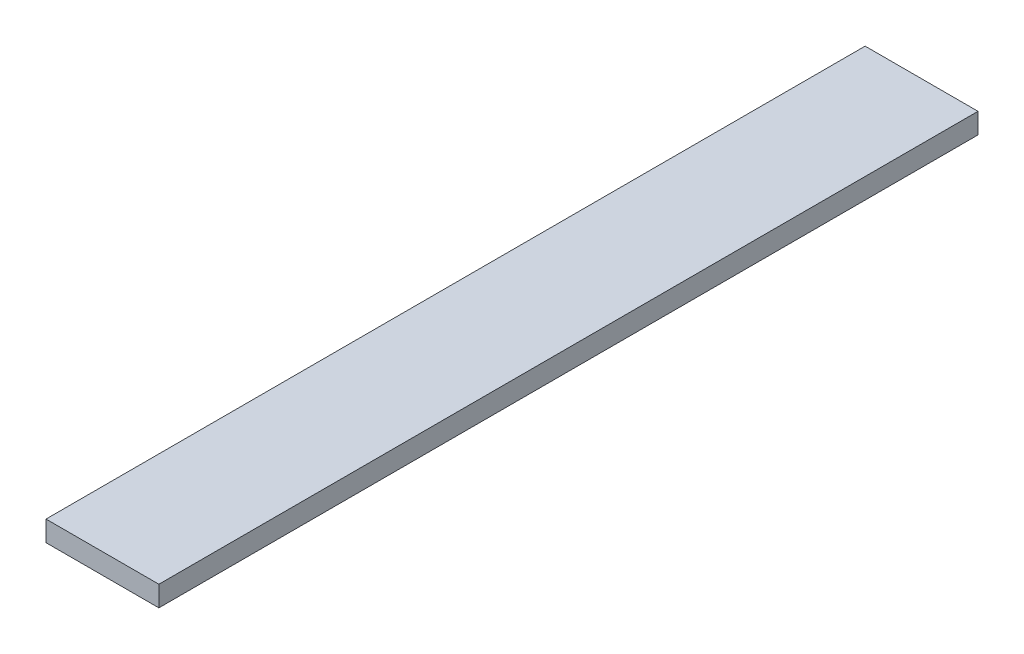
ISO-10303-21;
HEADER;
FILE_DESCRIPTION(('STEP AP214'),'2;1');
FILE_NAME('part.step','',(''),(''),'','','');
FILE_SCHEMA(('AUTOMOTIVE_DESIGN { 1 0 10303 214 1 1 1 1 }'));
ENDSEC;
DATA;
#1=APPLICATION_CONTEXT('core data for automotive mechanical design processes');
#2=APPLICATION_PROTOCOL_DEFINITION('international standard','automotive_design',2000,#1);
#3=PRODUCT_CONTEXT('',#1,'mechanical');
#4=PRODUCT('Part','Part','',(#3));
#5=PRODUCT_RELATED_PRODUCT_CATEGORY('part','',(#4));
#6=PRODUCT_DEFINITION_FORMATION('','',#4);
#7=PRODUCT_DEFINITION_CONTEXT('part definition',#1,'design');
#8=PRODUCT_DEFINITION('design','',#6,#7);
#9=PRODUCT_DEFINITION_SHAPE('','',#8);
#10=(LENGTH_UNIT() NAMED_UNIT(*) SI_UNIT(.MILLI.,.METRE.));
#11=(NAMED_UNIT(*) PLANE_ANGLE_UNIT() SI_UNIT($,.RADIAN.));
#12=(NAMED_UNIT(*) SI_UNIT($,.STERADIAN.) SOLID_ANGLE_UNIT());
#13=UNCERTAINTY_MEASURE_WITH_UNIT(LENGTH_MEASURE(1.E-05),#10,'distance_accuracy_value','');
#14=(GEOMETRIC_REPRESENTATION_CONTEXT(3) GLOBAL_UNCERTAINTY_ASSIGNED_CONTEXT((#13)) GLOBAL_UNIT_ASSIGNED_CONTEXT((#10,
#11,#12)) REPRESENTATION_CONTEXT('',''));
#15=CARTESIAN_POINT('',(0.,0.,0.));
#16=DIRECTION('',(0.,0.,1.));
#17=DIRECTION('',(1.,0.,0.));
#18=AXIS2_PLACEMENT_3D('',#15,#16,#17);
#19=CARTESIAN_POINT('',(0.,6.35,-254.));
#20=DIRECTION('',(1.,0.,0.));
#21=DIRECTION('',(0.,0.,-1.));
#22=AXIS2_PLACEMENT_3D('',#19,#20,#21);
#23=PLANE('',#22);
#24=DIRECTION('',(0.,0.,1.));
#25=VECTOR('',#24,1.);
#26=CARTESIAN_POINT('',(0.,0.,-254.));
#27=LINE('',#26,#25);
#28=CARTESIAN_POINT('',(0.,0.,-254.));
#29=VERTEX_POINT('',#28);
#30=CARTESIAN_POINT('',(0.,0.,0.));
#31=VERTEX_POINT('',#30);
#32=EDGE_CURVE('E101',#29,#31,#27,.T.);
#33=ORIENTED_EDGE('',*,*,#32,.T.);
#34=DIRECTION('',(0.,-1.,0.));
#35=VECTOR('',#34,1.);
#36=CARTESIAN_POINT('',(0.,6.35,0.));
#37=LINE('',#36,#35);
#38=CARTESIAN_POINT('',(0.,6.35,0.));
#39=VERTEX_POINT('',#38);
#40=EDGE_CURVE('E11',#39,#31,#37,.T.);
#41=ORIENTED_EDGE('',*,*,#40,.F.);
#42=DIRECTION('',(0.,0.,1.));
#43=VECTOR('',#42,1.);
#44=CARTESIAN_POINT('',(0.,6.35,-254.));
#45=LINE('',#44,#43);
#46=CARTESIAN_POINT('',(0.,6.35,-254.));
#47=VERTEX_POINT('',#46);
#48=EDGE_CURVE('E89',#47,#39,#45,.T.);
#49=ORIENTED_EDGE('',*,*,#48,.F.);
#50=DIRECTION('',(0.,-1.,0.));
#51=VECTOR('',#50,1.);
#52=CARTESIAN_POINT('',(0.,6.35,-254.));
#53=LINE('',#52,#51);
#54=EDGE_CURVE('E97',#47,#29,#53,.T.);
#55=ORIENTED_EDGE('',*,*,#54,.T.);
#56=EDGE_LOOP('',(#33,#41,#49,#55));
#57=FACE_BOUND('',#56,.T.);
#58=ADVANCED_FACE('F38',(#57),#23,.F.);
#59=CARTESIAN_POINT('',(0.,6.35,0.));
#60=DIRECTION('',(0.,0.,-1.));
#61=DIRECTION('',(-1.,0.,0.));
#62=AXIS2_PLACEMENT_3D('',#59,#60,#61);
#63=PLANE('',#62);
#64=DIRECTION('',(1.,0.,0.));
#65=VECTOR('',#64,1.);
#66=CARTESIAN_POINT('',(0.,0.,0.));
#67=LINE('',#66,#65);
#68=CARTESIAN_POINT('',(35.,0.,0.));
#69=VERTEX_POINT('',#68);
#70=EDGE_CURVE('E93',#31,#69,#67,.T.);
#71=ORIENTED_EDGE('',*,*,#70,.T.);
#72=DIRECTION('',(0.,-1.,0.));
#73=VECTOR('',#72,1.);
#74=CARTESIAN_POINT('',(35.,6.35,0.));
#75=LINE('',#74,#73);
#76=CARTESIAN_POINT('',(35.,6.35,0.));
#77=VERTEX_POINT('',#76);
#78=EDGE_CURVE('E46',#77,#69,#75,.T.);
#79=ORIENTED_EDGE('',*,*,#78,.F.);
#80=DIRECTION('',(1.,0.,0.));
#81=VECTOR('',#80,1.);
#82=CARTESIAN_POINT('',(0.,6.35,0.));
#83=LINE('',#82,#81);
#84=EDGE_CURVE('E84',#39,#77,#83,.T.);
#85=ORIENTED_EDGE('',*,*,#84,.F.);
#86=ORIENTED_EDGE('',*,*,#40,.T.);
#87=EDGE_LOOP('',(#71,#79,#85,#86));
#88=FACE_BOUND('',#87,.T.);
#89=ADVANCED_FACE('F92',(#88),#63,.F.);
#90=CARTESIAN_POINT('',(35.,6.35,0.));
#91=DIRECTION('',(-1.,0.,0.));
#92=DIRECTION('',(0.,0.,1.));
#93=AXIS2_PLACEMENT_3D('',#90,#91,#92);
#94=PLANE('',#93);
#95=DIRECTION('',(0.,0.,-1.));
#96=VECTOR('',#95,1.);
#97=CARTESIAN_POINT('',(35.,0.,0.));
#98=LINE('',#97,#96);
#99=CARTESIAN_POINT('',(35.,0.,-254.));
#100=VERTEX_POINT('',#99);
#101=EDGE_CURVE('E71',#69,#100,#98,.T.);
#102=ORIENTED_EDGE('',*,*,#101,.T.);
#103=DIRECTION('',(0.,-1.,0.));
#104=VECTOR('',#103,1.);
#105=CARTESIAN_POINT('',(35.,6.35,-254.));
#106=LINE('',#105,#104);
#107=CARTESIAN_POINT('',(35.,6.35,-254.));
#108=VERTEX_POINT('',#107);
#109=EDGE_CURVE('E94',#108,#100,#106,.T.);
#110=ORIENTED_EDGE('',*,*,#109,.F.);
#111=DIRECTION('',(0.,0.,-1.));
#112=VECTOR('',#111,1.);
#113=CARTESIAN_POINT('',(35.,6.35,0.));
#114=LINE('',#113,#112);
#115=EDGE_CURVE('E87',#77,#108,#114,.T.);
#116=ORIENTED_EDGE('',*,*,#115,.F.);
#117=ORIENTED_EDGE('',*,*,#78,.T.);
#118=EDGE_LOOP('',(#102,#110,#116,#117));
#119=FACE_BOUND('',#118,.T.);
#120=ADVANCED_FACE('F95',(#119),#94,.F.);
#121=CARTESIAN_POINT('',(35.,6.35,-254.));
#122=DIRECTION('',(0.,0.,1.));
#123=DIRECTION('',(1.,0.,0.));
#124=AXIS2_PLACEMENT_3D('',#121,#122,#123);
#125=PLANE('',#124);
#126=DIRECTION('',(-1.,0.,0.));
#127=VECTOR('',#126,1.);
#128=CARTESIAN_POINT('',(35.,0.,-254.));
#129=LINE('',#128,#127);
#130=EDGE_CURVE('E77',#100,#29,#129,.T.);
#131=ORIENTED_EDGE('',*,*,#130,.T.);
#132=ORIENTED_EDGE('',*,*,#54,.F.);
#133=DIRECTION('',(-1.,0.,0.));
#134=VECTOR('',#133,1.);
#135=CARTESIAN_POINT('',(35.,6.35,-254.));
#136=LINE('',#135,#134);
#137=EDGE_CURVE('E54',#108,#47,#136,.T.);
#138=ORIENTED_EDGE('',*,*,#137,.F.);
#139=ORIENTED_EDGE('',*,*,#109,.T.);
#140=EDGE_LOOP('',(#131,#132,#138,#139));
#141=FACE_BOUND('',#140,.T.);
#142=ADVANCED_FACE('F108',(#141),#125,.F.);
#143=CARTESIAN_POINT('',(0.,6.35,0.));
#144=DIRECTION('',(0.,1.,0.));
#145=DIRECTION('',(0.,0.,1.));
#146=AXIS2_PLACEMENT_3D('',#143,#144,#145);
#147=PLANE('',#146);
#148=ORIENTED_EDGE('',*,*,#48,.T.);
#149=ORIENTED_EDGE('',*,*,#84,.T.);
#150=ORIENTED_EDGE('',*,*,#115,.T.);
#151=ORIENTED_EDGE('',*,*,#137,.T.);
#152=EDGE_LOOP('',(#148,#149,#150,#151));
#153=FACE_BOUND('',#152,.T.);
#154=ADVANCED_FACE('F85',(#153),#147,.T.);
#155=CARTESIAN_POINT('',(0.,0.,0.));
#156=DIRECTION('',(0.,1.,0.));
#157=DIRECTION('',(0.,0.,1.));
#158=AXIS2_PLACEMENT_3D('',#155,#156,#157);
#159=PLANE('',#158);
#160=ORIENTED_EDGE('',*,*,#32,.F.);
#161=ORIENTED_EDGE('',*,*,#130,.F.);
#162=ORIENTED_EDGE('',*,*,#101,.F.);
#163=ORIENTED_EDGE('',*,*,#70,.F.);
#164=EDGE_LOOP('',(#160,#161,#162,#163));
#165=FACE_BOUND('',#164,.T.);
#166=ADVANCED_FACE('F111',(#165),#159,.F.);
#167=CLOSED_SHELL('',(#58,#89,#120,#142,#154,#166));
#168=MANIFOLD_SOLID_BREP('B2',#167);
#169=ADVANCED_BREP_SHAPE_REPRESENTATION('',(#18,#168),#14);
#170=SHAPE_DEFINITION_REPRESENTATION(#9,#169);
ENDSEC;
END-ISO-10303-21;
